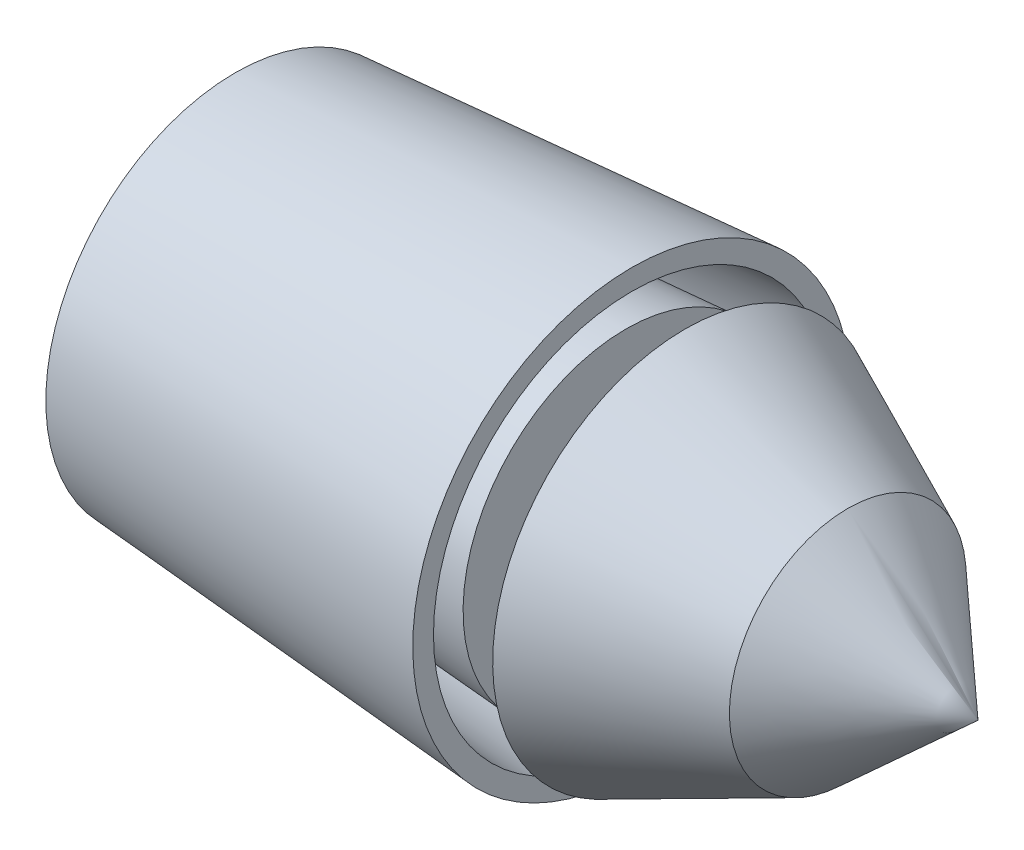
ISO-10303-21;
HEADER;
FILE_DESCRIPTION(('STEP AP214'),'2;1');
FILE_NAME('part.step','',(''),(''),'','','');
FILE_SCHEMA(('AUTOMOTIVE_DESIGN { 1 0 10303 214 1 1 1 1 }'));
ENDSEC;
DATA;
#1=APPLICATION_CONTEXT('core data for automotive mechanical design processes');
#2=APPLICATION_PROTOCOL_DEFINITION('international standard','automotive_design',2000,#1);
#3=PRODUCT_CONTEXT('',#1,'mechanical');
#4=PRODUCT('Part','Part','',(#3));
#5=PRODUCT_RELATED_PRODUCT_CATEGORY('part','',(#4));
#6=PRODUCT_DEFINITION_FORMATION('','',#4);
#7=PRODUCT_DEFINITION_CONTEXT('part definition',#1,'design');
#8=PRODUCT_DEFINITION('design','',#6,#7);
#9=PRODUCT_DEFINITION_SHAPE('','',#8);
#10=(LENGTH_UNIT() NAMED_UNIT(*) SI_UNIT(.MILLI.,.METRE.));
#11=(NAMED_UNIT(*) PLANE_ANGLE_UNIT() SI_UNIT($,.RADIAN.));
#12=(NAMED_UNIT(*) SI_UNIT($,.STERADIAN.) SOLID_ANGLE_UNIT());
#13=UNCERTAINTY_MEASURE_WITH_UNIT(LENGTH_MEASURE(1.E-05),#10,'distance_accuracy_value','');
#14=(GEOMETRIC_REPRESENTATION_CONTEXT(3) GLOBAL_UNCERTAINTY_ASSIGNED_CONTEXT((#13)) GLOBAL_UNIT_ASSIGNED_CONTEXT((#10,
#11,#12)) REPRESENTATION_CONTEXT('',''));
#15=CARTESIAN_POINT('',(0.,0.,0.));
#16=DIRECTION('',(0.,0.,1.));
#17=DIRECTION('',(1.,0.,0.));
#18=AXIS2_PLACEMENT_3D('',#15,#16,#17);
#19=CARTESIAN_POINT('',(7290.,0.,0.));
#20=DIRECTION('',(-1.,0.,0.));
#21=DIRECTION('',(0.,0.,1.));
#22=AXIS2_PLACEMENT_3D('',#19,#20,#21);
#23=CONICAL_SURFACE('',#22,0.,0.737815060120464);
#24=CARTESIAN_POINT('',(6850.,0.,0.));
#25=DIRECTION('',(-1.,0.,0.));
#26=DIRECTION('',(0.,0.,1.));
#27=AXIS2_PLACEMENT_3D('',#24,#25,#26);
#28=CIRCLE('',#27,400.);
#29=CARTESIAN_POINT('',(6850.,400.,-2.87183442387329E-06));
#30=VERTEX_POINT('',#29);
#31=CARTESIAN_POINT('',(6850.,400.,0.));
#32=VERTEX_POINT('',#31);
#33=EDGE_CURVE('E12',#30,#32,#28,.T.);
#34=ORIENTED_EDGE('',*,*,#33,.F.);
#35=DIRECTION('',(-0.739940073395944,0.672672793996312,-4.82951221450409E-09));
#36=VECTOR('',#35,1.);
#37=CARTESIAN_POINT('',(6850.,400.,-2.87183442387329E-06));
#38=LINE('',#37,#36);
#39=CARTESIAN_POINT('',(7290.,0.,0.));
#40=VERTEX_POINT('',#39);
#41=EDGE_CURVE('E89',#40,#30,#38,.T.);
#42=ORIENTED_EDGE('',*,*,#41,.F.);
#43=DIRECTION('',(-0.739940073395944,0.672672793996312,0.));
#44=VECTOR('',#43,1.);
#45=CARTESIAN_POINT('',(6850.,400.,0.));
#46=LINE('',#45,#44);
#47=EDGE_CURVE('E87',#40,#32,#46,.T.);
#48=ORIENTED_EDGE('',*,*,#47,.T.);
#49=EDGE_LOOP('',(#34,#42,#48));
#50=FACE_BOUND('',#49,.T.);
#51=ADVANCED_FACE('F49',(#50),#23,.T.);
#52=CARTESIAN_POINT('',(6850.,0.,0.));
#53=DIRECTION('',(-1.,0.,0.));
#54=DIRECTION('',(0.,0.,1.));
#55=AXIS2_PLACEMENT_3D('',#52,#53,#54);
#56=CONICAL_SURFACE('',#55,400.,0.426627493126876);
#57=CARTESIAN_POINT('',(6300.,0.,0.));
#58=DIRECTION('',(-1.,0.,0.));
#59=DIRECTION('',(0.,0.,1.));
#60=AXIS2_PLACEMENT_3D('',#57,#58,#59);
#61=CIRCLE('',#60,650.);
#62=CARTESIAN_POINT('',(6300.,650.,-4.6667309387941E-06));
#63=VERTEX_POINT('',#62);
#64=CARTESIAN_POINT('',(6300.,650.,0.));
#65=VERTEX_POINT('',#64);
#66=EDGE_CURVE('E60',#63,#65,#61,.T.);
#67=ORIENTED_EDGE('',*,*,#66,.F.);
#68=DIRECTION('',(-0.910366477462605,0.413802944301184,-2.97093385036065E-09));
#69=VECTOR('',#68,1.);
#70=CARTESIAN_POINT('',(6300.,650.,-4.6667309387941E-06));
#71=LINE('',#70,#69);
#72=EDGE_CURVE('E88',#30,#63,#71,.T.);
#73=ORIENTED_EDGE('',*,*,#72,.F.);
#74=ORIENTED_EDGE('',*,*,#33,.T.);
#75=DIRECTION('',(-0.910366477462605,0.413802944301184,0.));
#76=VECTOR('',#75,1.);
#77=CARTESIAN_POINT('',(6300.,650.,0.));
#78=LINE('',#77,#76);
#79=EDGE_CURVE('E82',#32,#65,#78,.T.);
#80=ORIENTED_EDGE('',*,*,#79,.T.);
#81=EDGE_LOOP('',(#67,#73,#74,#80));
#82=FACE_BOUND('',#81,.T.);
#83=ADVANCED_FACE('F81',(#82),#56,.T.);
#84=CARTESIAN_POINT('',(6300.,350.,-2.51285512088913E-06));
#85=DIRECTION('',(1.,0.,0.));
#86=DIRECTION('',(0.,0.,-1.));
#87=AXIS2_PLACEMENT_3D('',#84,#85,#86);
#88=PLANE('',#87);
#89=DIRECTION('',(0.,-1.,7.17958605968322E-09));
#90=VECTOR('',#89,1.);
#91=CARTESIAN_POINT('',(6300.,0.,0.));
#92=LINE('',#91,#90);
#93=CARTESIAN_POINT('',(6300.,0.,0.));
#94=VERTEX_POINT('',#93);
#95=EDGE_CURVE('E64',#63,#94,#92,.T.);
#96=ORIENTED_EDGE('',*,*,#95,.F.);
#97=ORIENTED_EDGE('',*,*,#66,.T.);
#98=DIRECTION('',(0.,-1.,0.));
#99=VECTOR('',#98,1.);
#100=CARTESIAN_POINT('',(6300.,350.,0.));
#101=LINE('',#100,#99);
#102=EDGE_CURVE('E96',#65,#94,#101,.T.);
#103=ORIENTED_EDGE('',*,*,#102,.T.);
#104=EDGE_LOOP('',(#96,#97,#103));
#105=FACE_BOUND('',#104,.T.);
#106=ADVANCED_FACE('F101',(#105),#88,.F.);
#107=CARTESIAN_POINT('',(0.,0.,0.));
#108=DIRECTION('',(0.,7.17958605968322E-09,1.));
#109=DIRECTION('',(1.,0.,0.));
#110=AXIS2_PLACEMENT_3D('',#107,#108,#109);
#111=PLANE('',#110);
#112=ORIENTED_EDGE('',*,*,#95,.T.);
#113=DIRECTION('',(1.,0.,0.));
#114=VECTOR('',#113,1.);
#115=CARTESIAN_POINT('',(7290.,0.,0.));
#116=LINE('',#115,#114);
#117=EDGE_CURVE('E102',#94,#40,#116,.T.);
#118=ORIENTED_EDGE('',*,*,#117,.T.);
#119=ORIENTED_EDGE('',*,*,#41,.T.);
#120=ORIENTED_EDGE('',*,*,#72,.T.);
#121=EDGE_LOOP('',(#112,#118,#119,#120));
#122=FACE_BOUND('',#121,.T.);
#123=ADVANCED_FACE('F107',(#122),#111,.T.);
#124=CARTESIAN_POINT('',(0.,0.,0.));
#125=DIRECTION('',(0.,0.,1.));
#126=DIRECTION('',(1.,0.,0.));
#127=AXIS2_PLACEMENT_3D('',#124,#125,#126);
#128=PLANE('',#127);
#129=ORIENTED_EDGE('',*,*,#117,.F.);
#130=ORIENTED_EDGE('',*,*,#102,.F.);
#131=ORIENTED_EDGE('',*,*,#79,.F.);
#132=ORIENTED_EDGE('',*,*,#47,.F.);
#133=EDGE_LOOP('',(#129,#130,#131,#132));
#134=FACE_BOUND('',#133,.T.);
#135=ADVANCED_FACE('F94',(#134),#128,.F.);
#136=CLOSED_SHELL('',(#51,#83,#106,#123,#135));
#137=MANIFOLD_SOLID_BREP('B2',#136);
#138=CARTESIAN_POINT('',(4780.,0.,0.));
#139=DIRECTION('',(1.,0.,0.));
#140=DIRECTION('',(0.,0.,-1.));
#141=AXIS2_PLACEMENT_3D('',#138,#139,#140);
#142=CONICAL_SURFACE('',#141,580.,0.0670634584356692);
#143=CARTESIAN_POINT('',(4780.,0.,0.));
#144=DIRECTION('',(-1.,0.,0.));
#145=DIRECTION('',(0.,0.,1.));
#146=AXIS2_PLACEMENT_3D('',#143,#144,#145);
#147=CIRCLE('',#146,580.);
#148=CARTESIAN_POINT('',(4780.,580.,-4.16415991461627E-06));
#149=VERTEX_POINT('',#148);
#150=CARTESIAN_POINT('',(4780.,580.,0.));
#151=VERTEX_POINT('',#150);
#152=EDGE_CURVE('E48',#149,#151,#147,.T.);
#153=ORIENTED_EDGE('',*,*,#152,.T.);
#154=DIRECTION('',(0.997752088960537,0.0670132000048122,0.));
#155=VECTOR('',#154,1.);
#156=CARTESIAN_POINT('',(6120.,670.,0.));
#157=LINE('',#156,#155);
#158=CARTESIAN_POINT('',(6120.,670.,0.));
#159=VERTEX_POINT('',#158);
#160=EDGE_CURVE('E208',#151,#159,#157,.T.);
#161=ORIENTED_EDGE('',*,*,#160,.T.);
#162=CARTESIAN_POINT('',(6120.,0.,0.));
#163=DIRECTION('',(-1.,0.,0.));
#164=DIRECTION('',(0.,0.,1.));
#165=AXIS2_PLACEMENT_3D('',#162,#163,#164);
#166=CIRCLE('',#165,670.);
#167=CARTESIAN_POINT('',(6120.,670.,-4.81032265998776E-06));
#168=VERTEX_POINT('',#167);
#169=EDGE_CURVE('E189',#168,#159,#166,.T.);
#170=ORIENTED_EDGE('',*,*,#169,.F.);
#171=DIRECTION('',(0.997752088960537,0.0670132000048122,-4.81127036569314E-10));
#172=VECTOR('',#171,1.);
#173=CARTESIAN_POINT('',(6120.,670.,-4.81032265998776E-06));
#174=LINE('',#173,#172);
#175=EDGE_CURVE('E218',#149,#168,#174,.T.);
#176=ORIENTED_EDGE('',*,*,#175,.F.);
#177=EDGE_LOOP('',(#153,#161,#170,#176));
#178=FACE_BOUND('',#177,.T.);
#179=ADVANCED_FACE('F148',(#178),#142,.F.);
#180=CARTESIAN_POINT('',(4780.,580.,-4.16415991461627E-06));
#181=DIRECTION('',(1.,0.,0.));
#182=DIRECTION('',(0.,0.,-1.));
#183=AXIS2_PLACEMENT_3D('',#180,#181,#182);
#184=PLANE('',#183);
#185=CARTESIAN_POINT('',(4780.,0.,0.));
#186=DIRECTION('',(-1.,0.,0.));
#187=DIRECTION('',(0.,0.,1.));
#188=AXIS2_PLACEMENT_3D('',#185,#186,#187);
#189=CIRCLE('',#188,640.);
#190=CARTESIAN_POINT('',(4780.,640.,-4.59493507819726E-06));
#191=VERTEX_POINT('',#190);
#192=CARTESIAN_POINT('',(4780.,640.,0.));
#193=VERTEX_POINT('',#192);
#194=EDGE_CURVE('E156',#191,#193,#189,.T.);
#195=ORIENTED_EDGE('',*,*,#194,.T.);
#196=DIRECTION('',(0.,-1.,0.));
#197=VECTOR('',#196,1.);
#198=CARTESIAN_POINT('',(4780.,580.,0.));
#199=LINE('',#198,#197);
#200=EDGE_CURVE('E215',#193,#151,#199,.T.);
#201=ORIENTED_EDGE('',*,*,#200,.T.);
#202=ORIENTED_EDGE('',*,*,#152,.F.);
#203=DIRECTION('',(0.,-1.,7.17958605968322E-09));
#204=VECTOR('',#203,1.);
#205=CARTESIAN_POINT('',(4780.,580.,-4.16415991461627E-06));
#206=LINE('',#205,#204);
#207=EDGE_CURVE('E205',#191,#149,#206,.T.);
#208=ORIENTED_EDGE('',*,*,#207,.F.);
#209=EDGE_LOOP('',(#195,#201,#202,#208));
#210=FACE_BOUND('',#209,.T.);
#211=ADVANCED_FACE('F155',(#210),#184,.F.);
#212=CARTESIAN_POINT('',(6120.,0.,0.));
#213=DIRECTION('',(1.,0.,0.));
#214=DIRECTION('',(0.,0.,-1.));
#215=AXIS2_PLACEMENT_3D('',#212,#213,#214);
#216=CONICAL_SURFACE('',#215,740.,0.0744887902138817);
#217=CARTESIAN_POINT('',(6120.,0.,0.));
#218=DIRECTION('',(-1.,0.,0.));
#219=DIRECTION('',(0.,0.,1.));
#220=AXIS2_PLACEMENT_3D('',#217,#218,#219);
#221=CIRCLE('',#220,740.);
#222=CARTESIAN_POINT('',(6120.,740.,-5.31289368416559E-06));
#223=VERTEX_POINT('',#222);
#224=CARTESIAN_POINT('',(6120.,740.,0.));
#225=VERTEX_POINT('',#224);
#226=EDGE_CURVE('E202',#223,#225,#221,.T.);
#227=ORIENTED_EDGE('',*,*,#226,.T.);
#228=DIRECTION('',(-0.997226992609779,-0.0744199248216253,0.));
#229=VECTOR('',#228,1.);
#230=CARTESIAN_POINT('',(4780.,640.,0.));
#231=LINE('',#230,#229);
#232=EDGE_CURVE('E209',#225,#193,#231,.T.);
#233=ORIENTED_EDGE('',*,*,#232,.T.);
#234=ORIENTED_EDGE('',*,*,#194,.F.);
#235=DIRECTION('',(-0.997226992609779,-0.0744199248216253,5.34304254812014E-10));
#236=VECTOR('',#235,1.);
#237=CARTESIAN_POINT('',(4780.,640.,-4.59493507819726E-06));
#238=LINE('',#237,#236);
#239=EDGE_CURVE('E219',#223,#191,#238,.T.);
#240=ORIENTED_EDGE('',*,*,#239,.F.);
#241=EDGE_LOOP('',(#227,#233,#234,#240));
#242=FACE_BOUND('',#241,.T.);
#243=ADVANCED_FACE('F225',(#242),#216,.T.);
#244=CARTESIAN_POINT('',(6120.,740.,-5.31289368416559E-06));
#245=DIRECTION('',(-1.,0.,0.));
#246=DIRECTION('',(0.,0.,1.));
#247=AXIS2_PLACEMENT_3D('',#244,#245,#246);
#248=PLANE('',#247);
#249=DIRECTION('',(0.,1.,-7.17958605968322E-09));
#250=VECTOR('',#249,1.);
#251=CARTESIAN_POINT('',(6120.,740.,-5.31289368416559E-06));
#252=LINE('',#251,#250);
#253=EDGE_CURVE('E197',#168,#223,#252,.T.);
#254=ORIENTED_EDGE('',*,*,#253,.F.);
#255=ORIENTED_EDGE('',*,*,#169,.T.);
#256=DIRECTION('',(0.,1.,0.));
#257=VECTOR('',#256,1.);
#258=CARTESIAN_POINT('',(6120.,740.,0.));
#259=LINE('',#258,#257);
#260=EDGE_CURVE('E194',#159,#225,#259,.T.);
#261=ORIENTED_EDGE('',*,*,#260,.T.);
#262=ORIENTED_EDGE('',*,*,#226,.F.);
#263=EDGE_LOOP('',(#254,#255,#261,#262));
#264=FACE_BOUND('',#263,.T.);
#265=ADVANCED_FACE('F195',(#264),#248,.F.);
#266=CARTESIAN_POINT('',(0.,0.,0.));
#267=DIRECTION('',(0.,-7.17958605968322E-09,-1.));
#268=DIRECTION('',(-1.,0.,0.));
#269=AXIS2_PLACEMENT_3D('',#266,#267,#268);
#270=PLANE('',#269);
#271=ORIENTED_EDGE('',*,*,#175,.T.);
#272=ORIENTED_EDGE('',*,*,#253,.T.);
#273=ORIENTED_EDGE('',*,*,#239,.T.);
#274=ORIENTED_EDGE('',*,*,#207,.T.);
#275=EDGE_LOOP('',(#271,#272,#273,#274));
#276=FACE_BOUND('',#275,.T.);
#277=ADVANCED_FACE('F222',(#276),#270,.F.);
#278=CARTESIAN_POINT('',(0.,0.,0.));
#279=DIRECTION('',(0.,0.,-1.));
#280=DIRECTION('',(-1.,0.,0.));
#281=AXIS2_PLACEMENT_3D('',#278,#279,#280);
#282=PLANE('',#281);
#283=ORIENTED_EDGE('',*,*,#160,.F.);
#284=ORIENTED_EDGE('',*,*,#200,.F.);
#285=ORIENTED_EDGE('',*,*,#232,.F.);
#286=ORIENTED_EDGE('',*,*,#260,.F.);
#287=EDGE_LOOP('',(#283,#284,#285,#286));
#288=FACE_BOUND('',#287,.T.);
#289=ADVANCED_FACE('F207',(#288),#282,.T.);
#290=CLOSED_SHELL('',(#179,#211,#243,#265,#277,#289));
#291=MANIFOLD_SOLID_BREP('B6',#290);
#292=CARTESIAN_POINT('',(0.,0.,0.));
#293=DIRECTION('',(-1.,0.,0.));
#294=DIRECTION('',(0.,0.,1.));
#295=AXIS2_PLACEMENT_3D('',#292,#293,#294);
#296=CYLINDRICAL_SURFACE('',#295,250.);
#297=CARTESIAN_POINT('',(4800.,0.,0.));
#298=DIRECTION('',(-1.,0.,0.));
#299=DIRECTION('',(0.,0.,1.));
#300=AXIS2_PLACEMENT_3D('',#297,#298,#299);
#301=CIRCLE('',#300,250.);
#302=CARTESIAN_POINT('',(4800.,250.,-1.79489651492081E-06));
#303=VERTEX_POINT('',#302);
#304=CARTESIAN_POINT('',(4800.,250.,0.));
#305=VERTEX_POINT('',#304);
#306=EDGE_CURVE('E149',#303,#305,#301,.T.);
#307=ORIENTED_EDGE('',*,*,#306,.T.);
#308=DIRECTION('',(1.,0.,0.));
#309=VECTOR('',#308,1.);
#310=CARTESIAN_POINT('',(6100.,250.,0.));
#311=LINE('',#310,#309);
#312=CARTESIAN_POINT('',(6100.,250.,0.));
#313=VERTEX_POINT('',#312);
#314=EDGE_CURVE('E325',#305,#313,#311,.T.);
#315=ORIENTED_EDGE('',*,*,#314,.T.);
#316=CARTESIAN_POINT('',(6100.,0.,0.));
#317=DIRECTION('',(-1.,0.,0.));
#318=DIRECTION('',(0.,0.,1.));
#319=AXIS2_PLACEMENT_3D('',#316,#317,#318);
#320=CIRCLE('',#319,250.);
#321=CARTESIAN_POINT('',(6100.,250.,-1.79489651492081E-06));
#322=VERTEX_POINT('',#321);
#323=EDGE_CURVE('E305',#322,#313,#320,.T.);
#324=ORIENTED_EDGE('',*,*,#323,.F.);
#325=DIRECTION('',(1.,0.,0.));
#326=VECTOR('',#325,1.);
#327=CARTESIAN_POINT('',(6100.,250.,-1.79489651492081E-06));
#328=LINE('',#327,#326);
#329=EDGE_CURVE('E328',#303,#322,#328,.T.);
#330=ORIENTED_EDGE('',*,*,#329,.F.);
#331=EDGE_LOOP('',(#307,#315,#324,#330));
#332=FACE_BOUND('',#331,.T.);
#333=ADVANCED_FACE('F264',(#332),#296,.F.);
#334=CARTESIAN_POINT('',(4800.,250.,-1.79489651492081E-06));
#335=DIRECTION('',(1.,0.,0.));
#336=DIRECTION('',(0.,0.,-1.));
#337=AXIS2_PLACEMENT_3D('',#334,#335,#336);
#338=PLANE('',#337);
#339=CARTESIAN_POINT('',(4800.,0.,0.));
#340=DIRECTION('',(-1.,0.,0.));
#341=DIRECTION('',(0.,0.,1.));
#342=AXIS2_PLACEMENT_3D('',#339,#340,#341);
#343=CIRCLE('',#342,460.);
#344=CARTESIAN_POINT('',(4800.,460.,-3.30260958745428E-06));
#345=VERTEX_POINT('',#344);
#346=CARTESIAN_POINT('',(4800.,460.,0.));
#347=VERTEX_POINT('',#346);
#348=EDGE_CURVE('E275',#345,#347,#343,.T.);
#349=ORIENTED_EDGE('',*,*,#348,.T.);
#350=DIRECTION('',(0.,-1.,0.));
#351=VECTOR('',#350,1.);
#352=CARTESIAN_POINT('',(4800.,250.,0.));
#353=LINE('',#352,#351);
#354=EDGE_CURVE('E329',#347,#305,#353,.T.);
#355=ORIENTED_EDGE('',*,*,#354,.T.);
#356=ORIENTED_EDGE('',*,*,#306,.F.);
#357=DIRECTION('',(0.,-1.,7.17958605968322E-09));
#358=VECTOR('',#357,1.);
#359=CARTESIAN_POINT('',(4800.,250.,-1.79489651492081E-06));
#360=LINE('',#359,#358);
#361=EDGE_CURVE('E316',#345,#303,#360,.T.);
#362=ORIENTED_EDGE('',*,*,#361,.F.);
#363=EDGE_LOOP('',(#349,#355,#356,#362));
#364=FACE_BOUND('',#363,.T.);
#365=ADVANCED_FACE('F266',(#364),#338,.F.);
#366=CARTESIAN_POINT('',(6100.,0.,0.));
#367=DIRECTION('',(1.,0.,0.));
#368=DIRECTION('',(0.,0.,-1.));
#369=AXIS2_PLACEMENT_3D('',#366,#367,#368);
#370=CONICAL_SURFACE('',#369,550.,0.0691204808471823);
#371=CARTESIAN_POINT('',(6100.,0.,0.));
#372=DIRECTION('',(-1.,0.,0.));
#373=DIRECTION('',(0.,0.,1.));
#374=AXIS2_PLACEMENT_3D('',#371,#372,#373);
#375=CIRCLE('',#374,550.);
#376=CARTESIAN_POINT('',(6100.,550.,-3.94877233282577E-06));
#377=VERTEX_POINT('',#376);
#378=CARTESIAN_POINT('',(6100.,550.,0.));
#379=VERTEX_POINT('',#378);
#380=EDGE_CURVE('E314',#377,#379,#375,.T.);
#381=ORIENTED_EDGE('',*,*,#380,.T.);
#382=DIRECTION('',(-0.997612130489456,-0.0690654551877316,0.));
#383=VECTOR('',#382,1.);
#384=CARTESIAN_POINT('',(4800.,460.,0.));
#385=LINE('',#384,#383);
#386=EDGE_CURVE('E322',#379,#347,#385,.T.);
#387=ORIENTED_EDGE('',*,*,#386,.T.);
#388=ORIENTED_EDGE('',*,*,#348,.F.);
#389=DIRECTION('',(-0.997612130489456,-0.0690654551877316,4.95861379271514E-10));
#390=VECTOR('',#389,1.);
#391=CARTESIAN_POINT('',(4800.,460.,-3.30260958745428E-06));
#392=LINE('',#391,#390);
#393=EDGE_CURVE('E333',#377,#345,#392,.T.);
#394=ORIENTED_EDGE('',*,*,#393,.F.);
#395=EDGE_LOOP('',(#381,#387,#388,#394));
#396=FACE_BOUND('',#395,.T.);
#397=ADVANCED_FACE('F337',(#396),#370,.T.);
#398=CARTESIAN_POINT('',(6100.,550.,-3.94877233282577E-06));
#399=DIRECTION('',(-1.,0.,0.));
#400=DIRECTION('',(0.,0.,1.));
#401=AXIS2_PLACEMENT_3D('',#398,#399,#400);
#402=PLANE('',#401);
#403=DIRECTION('',(0.,1.,-7.17958605968322E-09));
#404=VECTOR('',#403,1.);
#405=CARTESIAN_POINT('',(6100.,550.,-3.94877233282577E-06));
#406=LINE('',#405,#404);
#407=EDGE_CURVE('E307',#322,#377,#406,.T.);
#408=ORIENTED_EDGE('',*,*,#407,.F.);
#409=ORIENTED_EDGE('',*,*,#323,.T.);
#410=DIRECTION('',(0.,1.,0.));
#411=VECTOR('',#410,1.);
#412=CARTESIAN_POINT('',(6100.,550.,0.));
#413=LINE('',#412,#411);
#414=EDGE_CURVE('E310',#313,#379,#413,.T.);
#415=ORIENTED_EDGE('',*,*,#414,.T.);
#416=ORIENTED_EDGE('',*,*,#380,.F.);
#417=EDGE_LOOP('',(#408,#409,#415,#416));
#418=FACE_BOUND('',#417,.T.);
#419=ADVANCED_FACE('F308',(#418),#402,.F.);
#420=CARTESIAN_POINT('',(0.,0.,0.));
#421=DIRECTION('',(0.,-7.17958605968322E-09,-1.));
#422=DIRECTION('',(-1.,0.,0.));
#423=AXIS2_PLACEMENT_3D('',#420,#421,#422);
#424=PLANE('',#423);
#425=ORIENTED_EDGE('',*,*,#329,.T.);
#426=ORIENTED_EDGE('',*,*,#407,.T.);
#427=ORIENTED_EDGE('',*,*,#393,.T.);
#428=ORIENTED_EDGE('',*,*,#361,.T.);
#429=EDGE_LOOP('',(#425,#426,#427,#428));
#430=FACE_BOUND('',#429,.T.);
#431=ADVANCED_FACE('F336',(#430),#424,.F.);
#432=CARTESIAN_POINT('',(0.,0.,0.));
#433=DIRECTION('',(0.,0.,-1.));
#434=DIRECTION('',(-1.,0.,0.));
#435=AXIS2_PLACEMENT_3D('',#432,#433,#434);
#436=PLANE('',#435);
#437=ORIENTED_EDGE('',*,*,#314,.F.);
#438=ORIENTED_EDGE('',*,*,#354,.F.);
#439=ORIENTED_EDGE('',*,*,#386,.F.);
#440=ORIENTED_EDGE('',*,*,#414,.F.);
#441=EDGE_LOOP('',(#437,#438,#439,#440));
#442=FACE_BOUND('',#441,.T.);
#443=ADVANCED_FACE('F319',(#442),#436,.T.);
#444=CLOSED_SHELL('',(#333,#365,#397,#419,#431,#443));
#445=MANIFOLD_SOLID_BREP('B45',#444);
#446=ADVANCED_BREP_SHAPE_REPRESENTATION('',(#18,#137,#291,#445),#14);
#447=SHAPE_DEFINITION_REPRESENTATION(#9,#446);
ENDSEC;
END-ISO-10303-21;
